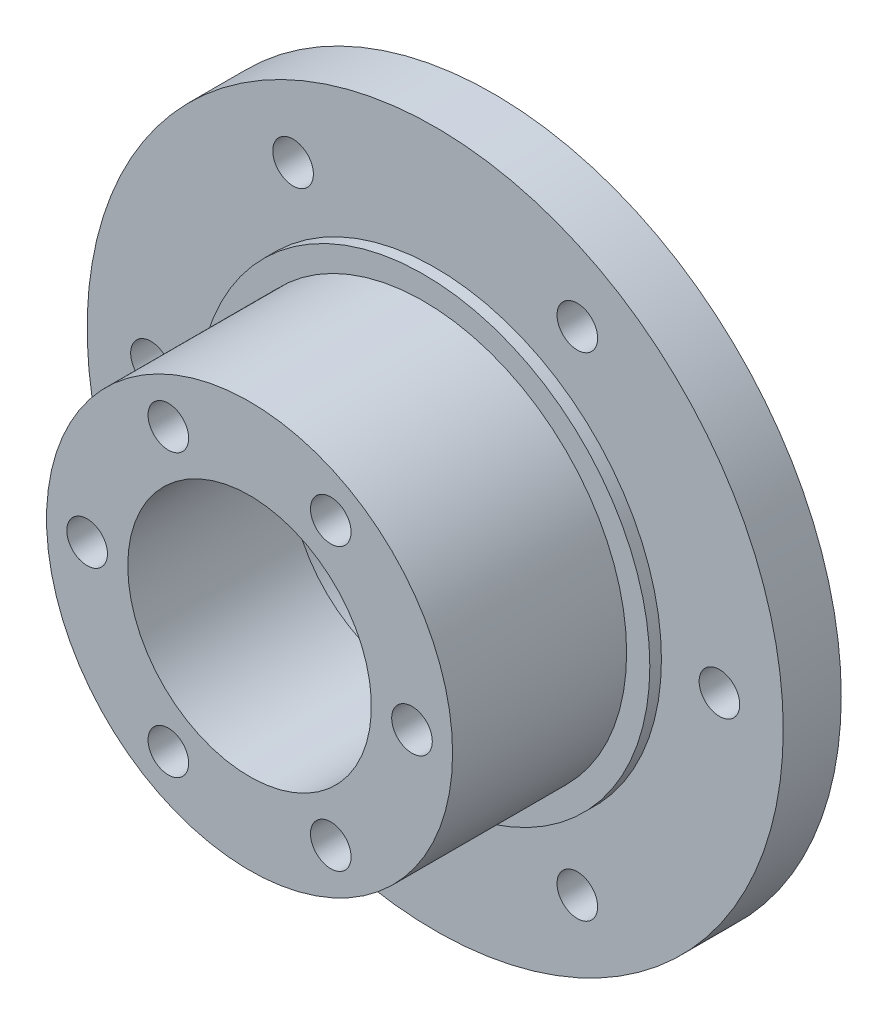
ISO-10303-21;
HEADER;
FILE_DESCRIPTION(('STEP AP214'),'2;1');
FILE_NAME('part.step','',(''),(''),'','','');
FILE_SCHEMA(('AUTOMOTIVE_DESIGN { 1 0 10303 214 1 1 1 1 }'));
ENDSEC;
DATA;
#1=APPLICATION_CONTEXT('core data for automotive mechanical design processes');
#2=APPLICATION_PROTOCOL_DEFINITION('international standard','automotive_design',2000,#1);
#3=PRODUCT_CONTEXT('',#1,'mechanical');
#4=PRODUCT('Part','Part','',(#3));
#5=PRODUCT_RELATED_PRODUCT_CATEGORY('part','',(#4));
#6=PRODUCT_DEFINITION_FORMATION('','',#4);
#7=PRODUCT_DEFINITION_CONTEXT('part definition',#1,'design');
#8=PRODUCT_DEFINITION('design','',#6,#7);
#9=PRODUCT_DEFINITION_SHAPE('','',#8);
#10=(LENGTH_UNIT() NAMED_UNIT(*) SI_UNIT(.MILLI.,.METRE.));
#11=(NAMED_UNIT(*) PLANE_ANGLE_UNIT() SI_UNIT($,.RADIAN.));
#12=(NAMED_UNIT(*) SI_UNIT($,.STERADIAN.) SOLID_ANGLE_UNIT());
#13=UNCERTAINTY_MEASURE_WITH_UNIT(LENGTH_MEASURE(1.E-05),#10,'distance_accuracy_value','');
#14=(GEOMETRIC_REPRESENTATION_CONTEXT(3) GLOBAL_UNCERTAINTY_ASSIGNED_CONTEXT((#13)) GLOBAL_UNIT_ASSIGNED_CONTEXT((#10,
#11,#12)) REPRESENTATION_CONTEXT('',''));
#15=CARTESIAN_POINT('',(0.,0.,0.));
#16=DIRECTION('',(0.,0.,1.));
#17=DIRECTION('',(1.,0.,0.));
#18=AXIS2_PLACEMENT_3D('',#15,#16,#17);
#19=CARTESIAN_POINT('',(0.,0.,5.));
#20=DIRECTION('',(0.,0.,-1.));
#21=DIRECTION('',(-1.,0.,0.));
#22=AXIS2_PLACEMENT_3D('',#19,#20,#21);
#23=CYLINDRICAL_SURFACE('',#22,30.);
#24=CARTESIAN_POINT('',(0.,0.,5.));
#25=DIRECTION('',(0.,0.,1.));
#26=DIRECTION('',(1.,0.,0.));
#27=AXIS2_PLACEMENT_3D('',#24,#25,#26);
#28=CIRCLE('',#27,30.);
#29=CARTESIAN_POINT('',(30.,0.,5.));
#30=VERTEX_POINT('',#29);
#31=EDGE_CURVE('E47',#30,#30,#28,.T.);
#32=ORIENTED_EDGE('',*,*,#31,.F.);
#33=EDGE_LOOP('',(#32));
#34=FACE_BOUND('',#33,.T.);
#35=CARTESIAN_POINT('',(0.,0.,0.));
#36=DIRECTION('',(0.,0.,1.));
#37=DIRECTION('',(1.,0.,0.));
#38=AXIS2_PLACEMENT_3D('',#35,#36,#37);
#39=CIRCLE('',#38,30.);
#40=CARTESIAN_POINT('',(30.,0.,0.));
#41=VERTEX_POINT('',#40);
#42=EDGE_CURVE('E38',#41,#41,#39,.T.);
#43=ORIENTED_EDGE('',*,*,#42,.T.);
#44=EDGE_LOOP('',(#43));
#45=FACE_BOUND('',#44,.T.);
#46=ADVANCED_FACE('F35',(#34,#45),#23,.T.);
#47=CARTESIAN_POINT('',(0.,0.,5.));
#48=DIRECTION('',(0.,0.,1.));
#49=DIRECTION('',(1.,0.,0.));
#50=AXIS2_PLACEMENT_3D('',#47,#48,#49);
#51=PLANE('',#50);
#52=CARTESIAN_POINT('',(24.5,0.,5.));
#53=DIRECTION('',(0.,0.,1.));
#54=DIRECTION('',(1.,0.,0.));
#55=AXIS2_PLACEMENT_3D('',#52,#53,#54);
#56=CIRCLE('',#55,1.75);
#57=CARTESIAN_POINT('',(26.25,0.,5.));
#58=VERTEX_POINT('',#57);
#59=EDGE_CURVE('E388',#58,#58,#56,.T.);
#60=ORIENTED_EDGE('',*,*,#59,.F.);
#61=EDGE_LOOP('',(#60));
#62=FACE_BOUND('',#61,.T.);
#63=CARTESIAN_POINT('',(12.2500000000002,21.2176223927186,5.));
#64=DIRECTION('',(0.,0.,1.));
#65=DIRECTION('',(1.,0.,0.));
#66=AXIS2_PLACEMENT_3D('',#63,#64,#65);
#67=CIRCLE('',#66,1.75);
#68=CARTESIAN_POINT('',(14.0000000000002,21.2176223927186,5.));
#69=VERTEX_POINT('',#68);
#70=EDGE_CURVE('E389',#69,#69,#67,.T.);
#71=ORIENTED_EDGE('',*,*,#70,.F.);
#72=EDGE_LOOP('',(#71));
#73=FACE_BOUND('',#72,.T.);
#74=CARTESIAN_POINT('',(-12.2499999999998,21.2176223927189,5.));
#75=DIRECTION('',(0.,0.,1.));
#76=DIRECTION('',(1.,0.,0.));
#77=AXIS2_PLACEMENT_3D('',#74,#75,#76);
#78=CIRCLE('',#77,1.75);
#79=CARTESIAN_POINT('',(-10.4999999999998,21.2176223927189,5.));
#80=VERTEX_POINT('',#79);
#81=EDGE_CURVE('E363',#80,#80,#78,.T.);
#82=ORIENTED_EDGE('',*,*,#81,.F.);
#83=EDGE_LOOP('',(#82));
#84=FACE_BOUND('',#83,.T.);
#85=CARTESIAN_POINT('',(-24.5,1.71082585603314E-13,5.));
#86=DIRECTION('',(0.,0.,1.));
#87=DIRECTION('',(1.,0.,0.));
#88=AXIS2_PLACEMENT_3D('',#85,#86,#87);
#89=CIRCLE('',#88,1.75);
#90=CARTESIAN_POINT('',(-22.75,1.71082585603314E-13,5.));
#91=VERTEX_POINT('',#90);
#92=EDGE_CURVE('E370',#91,#91,#89,.T.);
#93=ORIENTED_EDGE('',*,*,#92,.F.);
#94=EDGE_LOOP('',(#93));
#95=FACE_BOUND('',#94,.T.);
#96=CARTESIAN_POINT('',(-12.2500000000001,-21.2176223927187,5.));
#97=DIRECTION('',(0.,0.,1.));
#98=DIRECTION('',(1.,0.,0.));
#99=AXIS2_PLACEMENT_3D('',#96,#97,#98);
#100=CIRCLE('',#99,1.75);
#101=CARTESIAN_POINT('',(-10.5000000000001,-21.2176223927187,5.));
#102=VERTEX_POINT('',#101);
#103=EDGE_CURVE('E376',#102,#102,#100,.T.);
#104=ORIENTED_EDGE('',*,*,#103,.F.);
#105=EDGE_LOOP('',(#104));
#106=FACE_BOUND('',#105,.T.);
#107=CARTESIAN_POINT('',(12.25,-21.2176223927188,5.));
#108=DIRECTION('',(0.,0.,1.));
#109=DIRECTION('',(1.,0.,0.));
#110=AXIS2_PLACEMENT_3D('',#107,#108,#109);
#111=CIRCLE('',#110,1.75);
#112=CARTESIAN_POINT('',(14.,-21.2176223927188,5.));
#113=VERTEX_POINT('',#112);
#114=EDGE_CURVE('E382',#113,#113,#111,.T.);
#115=ORIENTED_EDGE('',*,*,#114,.F.);
#116=EDGE_LOOP('',(#115));
#117=FACE_BOUND('',#116,.T.);
#118=CARTESIAN_POINT('',(0.,0.,5.));
#119=DIRECTION('',(0.,0.,1.));
#120=DIRECTION('',(1.,0.,0.));
#121=AXIS2_PLACEMENT_3D('',#118,#119,#120);
#122=CIRCLE('',#121,19.5);
#123=CARTESIAN_POINT('',(19.5,0.,5.));
#124=VERTEX_POINT('',#123);
#125=EDGE_CURVE('E42',#124,#124,#122,.T.);
#126=ORIENTED_EDGE('',*,*,#125,.F.);
#127=EDGE_LOOP('',(#126));
#128=FACE_BOUND('',#127,.T.);
#129=ORIENTED_EDGE('',*,*,#31,.T.);
#130=EDGE_LOOP('',(#129));
#131=FACE_BOUND('',#130,.T.);
#132=ADVANCED_FACE('F65',(#62,#73,#84,#95,#106,#117,#128,#131),#51,.T.);
#133=CARTESIAN_POINT('',(0.,0.,0.));
#134=DIRECTION('',(0.,0.,1.));
#135=DIRECTION('',(1.,0.,0.));
#136=AXIS2_PLACEMENT_3D('',#133,#134,#135);
#137=PLANE('',#136);
#138=CARTESIAN_POINT('',(24.5,0.,0.));
#139=DIRECTION('',(0.,0.,1.));
#140=DIRECTION('',(1.,0.,0.));
#141=AXIS2_PLACEMENT_3D('',#138,#139,#140);
#142=CIRCLE('',#141,1.75);
#143=CARTESIAN_POINT('',(26.25,0.,0.));
#144=VERTEX_POINT('',#143);
#145=EDGE_CURVE('E360',#144,#144,#142,.T.);
#146=ORIENTED_EDGE('',*,*,#145,.T.);
#147=EDGE_LOOP('',(#146));
#148=FACE_BOUND('',#147,.T.);
#149=CARTESIAN_POINT('',(12.2500000000002,21.2176223927186,0.));
#150=DIRECTION('',(0.,0.,1.));
#151=DIRECTION('',(1.,0.,0.));
#152=AXIS2_PLACEMENT_3D('',#149,#150,#151);
#153=CIRCLE('',#152,1.75);
#154=CARTESIAN_POINT('',(14.0000000000002,21.2176223927186,0.));
#155=VERTEX_POINT('',#154);
#156=EDGE_CURVE('E367',#155,#155,#153,.T.);
#157=ORIENTED_EDGE('',*,*,#156,.T.);
#158=EDGE_LOOP('',(#157));
#159=FACE_BOUND('',#158,.T.);
#160=CARTESIAN_POINT('',(-12.2499999999998,21.2176223927189,0.));
#161=DIRECTION('',(0.,0.,1.));
#162=DIRECTION('',(1.,0.,0.));
#163=AXIS2_PLACEMENT_3D('',#160,#161,#162);
#164=CIRCLE('',#163,1.75);
#165=CARTESIAN_POINT('',(-10.4999999999998,21.2176223927189,0.));
#166=VERTEX_POINT('',#165);
#167=EDGE_CURVE('E366',#166,#166,#164,.T.);
#168=ORIENTED_EDGE('',*,*,#167,.T.);
#169=EDGE_LOOP('',(#168));
#170=FACE_BOUND('',#169,.T.);
#171=CARTESIAN_POINT('',(-24.5,1.71082585603314E-13,0.));
#172=DIRECTION('',(0.,0.,1.));
#173=DIRECTION('',(1.,0.,0.));
#174=AXIS2_PLACEMENT_3D('',#171,#172,#173);
#175=CIRCLE('',#174,1.75);
#176=CARTESIAN_POINT('',(-22.75,1.71082585603314E-13,0.));
#177=VERTEX_POINT('',#176);
#178=EDGE_CURVE('E373',#177,#177,#175,.T.);
#179=ORIENTED_EDGE('',*,*,#178,.T.);
#180=EDGE_LOOP('',(#179));
#181=FACE_BOUND('',#180,.T.);
#182=CARTESIAN_POINT('',(-12.2500000000001,-21.2176223927187,0.));
#183=DIRECTION('',(0.,0.,1.));
#184=DIRECTION('',(1.,0.,0.));
#185=AXIS2_PLACEMENT_3D('',#182,#183,#184);
#186=CIRCLE('',#185,1.75);
#187=CARTESIAN_POINT('',(-10.5000000000001,-21.2176223927187,0.));
#188=VERTEX_POINT('',#187);
#189=EDGE_CURVE('E379',#188,#188,#186,.T.);
#190=ORIENTED_EDGE('',*,*,#189,.T.);
#191=EDGE_LOOP('',(#190));
#192=FACE_BOUND('',#191,.T.);
#193=CARTESIAN_POINT('',(12.25,-21.2176223927188,0.));
#194=DIRECTION('',(0.,0.,1.));
#195=DIRECTION('',(1.,0.,0.));
#196=AXIS2_PLACEMENT_3D('',#193,#194,#195);
#197=CIRCLE('',#196,1.75);
#198=CARTESIAN_POINT('',(14.,-21.2176223927188,0.));
#199=VERTEX_POINT('',#198);
#200=EDGE_CURVE('E385',#199,#199,#197,.T.);
#201=ORIENTED_EDGE('',*,*,#200,.T.);
#202=EDGE_LOOP('',(#201));
#203=FACE_BOUND('',#202,.T.);
#204=CARTESIAN_POINT('',(0.,0.,0.));
#205=DIRECTION('',(0.,0.,-1.));
#206=DIRECTION('',(-1.,0.,0.));
#207=AXIS2_PLACEMENT_3D('',#204,#205,#206);
#208=CIRCLE('',#207,12.025);
#209=CARTESIAN_POINT('',(-12.025,0.,0.));
#210=VERTEX_POINT('',#209);
#211=EDGE_CURVE('E350',#210,#210,#208,.T.);
#212=ORIENTED_EDGE('',*,*,#211,.F.);
#213=EDGE_LOOP('',(#212));
#214=FACE_BOUND('',#213,.T.);
#215=ORIENTED_EDGE('',*,*,#42,.F.);
#216=EDGE_LOOP('',(#215));
#217=FACE_BOUND('',#216,.T.);
#218=ADVANCED_FACE('F62',(#148,#159,#170,#181,#192,#203,#214,#217),#137,.F.);
#219=CARTESIAN_POINT('',(0.,0.,6.));
#220=DIRECTION('',(0.,0.,-1.));
#221=DIRECTION('',(-1.,0.,0.));
#222=AXIS2_PLACEMENT_3D('',#219,#220,#221);
#223=CYLINDRICAL_SURFACE('',#222,19.5);
#224=CARTESIAN_POINT('',(0.,0.,6.));
#225=DIRECTION('',(0.,0.,1.));
#226=DIRECTION('',(1.,0.,0.));
#227=AXIS2_PLACEMENT_3D('',#224,#225,#226);
#228=CIRCLE('',#227,19.5);
#229=CARTESIAN_POINT('',(19.5,0.,6.));
#230=VERTEX_POINT('',#229);
#231=EDGE_CURVE('E53',#230,#230,#228,.T.);
#232=ORIENTED_EDGE('',*,*,#231,.F.);
#233=EDGE_LOOP('',(#232));
#234=FACE_BOUND('',#233,.T.);
#235=ORIENTED_EDGE('',*,*,#125,.T.);
#236=EDGE_LOOP('',(#235));
#237=FACE_BOUND('',#236,.T.);
#238=ADVANCED_FACE('F64',(#234,#237),#223,.T.);
#239=CARTESIAN_POINT('',(0.,0.,6.));
#240=DIRECTION('',(0.,0.,1.));
#241=DIRECTION('',(1.,0.,0.));
#242=AXIS2_PLACEMENT_3D('',#239,#240,#241);
#243=PLANE('',#242);
#244=CARTESIAN_POINT('',(0.,0.,6.));
#245=DIRECTION('',(0.,0.,1.));
#246=DIRECTION('',(1.,0.,0.));
#247=AXIS2_PLACEMENT_3D('',#244,#245,#246);
#248=CIRCLE('',#247,17.5);
#249=CARTESIAN_POINT('',(17.5,0.,6.));
#250=VERTEX_POINT('',#249);
#251=EDGE_CURVE('E10',#250,#250,#248,.T.);
#252=ORIENTED_EDGE('',*,*,#251,.F.);
#253=EDGE_LOOP('',(#252));
#254=FACE_BOUND('',#253,.T.);
#255=ORIENTED_EDGE('',*,*,#231,.T.);
#256=EDGE_LOOP('',(#255));
#257=FACE_BOUND('',#256,.T.);
#258=ADVANCED_FACE('F71',(#254,#257),#243,.T.);
#259=CARTESIAN_POINT('',(0.,0.,21.));
#260=DIRECTION('',(0.,0.,-1.));
#261=DIRECTION('',(-1.,0.,0.));
#262=AXIS2_PLACEMENT_3D('',#259,#260,#261);
#263=CYLINDRICAL_SURFACE('',#262,17.5);
#264=CARTESIAN_POINT('',(0.,0.,21.));
#265=DIRECTION('',(0.,0.,1.));
#266=DIRECTION('',(1.,0.,0.));
#267=AXIS2_PLACEMENT_3D('',#264,#265,#266);
#268=CIRCLE('',#267,17.5);
#269=CARTESIAN_POINT('',(17.5,0.,21.));
#270=VERTEX_POINT('',#269);
#271=EDGE_CURVE('E51',#270,#270,#268,.T.);
#272=ORIENTED_EDGE('',*,*,#271,.F.);
#273=EDGE_LOOP('',(#272));
#274=FACE_BOUND('',#273,.T.);
#275=ORIENTED_EDGE('',*,*,#251,.T.);
#276=EDGE_LOOP('',(#275));
#277=FACE_BOUND('',#276,.T.);
#278=ADVANCED_FACE('F172',(#274,#277),#263,.T.);
#279=CARTESIAN_POINT('',(0.,0.,21.));
#280=DIRECTION('',(0.,0.,1.));
#281=DIRECTION('',(1.,0.,0.));
#282=AXIS2_PLACEMENT_3D('',#279,#280,#281);
#283=PLANE('',#282);
#284=CARTESIAN_POINT('',(14.,0.,21.));
#285=DIRECTION('',(0.,0.,1.));
#286=DIRECTION('',(1.,0.,0.));
#287=AXIS2_PLACEMENT_3D('',#284,#285,#286);
#288=CIRCLE('',#287,1.75);
#289=CARTESIAN_POINT('',(15.75,0.,21.));
#290=VERTEX_POINT('',#289);
#291=EDGE_CURVE('E423',#290,#290,#288,.T.);
#292=ORIENTED_EDGE('',*,*,#291,.F.);
#293=EDGE_LOOP('',(#292));
#294=FACE_BOUND('',#293,.T.);
#295=CARTESIAN_POINT('',(7.00000000000014,12.1243556529821,21.));
#296=DIRECTION('',(0.,0.,1.));
#297=DIRECTION('',(1.,0.,0.));
#298=AXIS2_PLACEMENT_3D('',#295,#296,#297);
#299=CIRCLE('',#298,1.75);
#300=CARTESIAN_POINT('',(8.75000000000014,12.1243556529821,21.));
#301=VERTEX_POINT('',#300);
#302=EDGE_CURVE('E424',#301,#301,#299,.T.);
#303=ORIENTED_EDGE('',*,*,#302,.F.);
#304=EDGE_LOOP('',(#303));
#305=FACE_BOUND('',#304,.T.);
#306=CARTESIAN_POINT('',(-6.99999999999989,12.1243556529822,21.));
#307=DIRECTION('',(0.,0.,1.));
#308=DIRECTION('',(1.,0.,0.));
#309=AXIS2_PLACEMENT_3D('',#306,#307,#308);
#310=CIRCLE('',#309,1.75);
#311=CARTESIAN_POINT('',(-5.24999999999989,12.1243556529822,21.));
#312=VERTEX_POINT('',#311);
#313=EDGE_CURVE('E398',#312,#312,#310,.T.);
#314=ORIENTED_EDGE('',*,*,#313,.F.);
#315=EDGE_LOOP('',(#314));
#316=FACE_BOUND('',#315,.T.);
#317=CARTESIAN_POINT('',(-14.,0.,21.));
#318=DIRECTION('',(0.,0.,1.));
#319=DIRECTION('',(1.,0.,0.));
#320=AXIS2_PLACEMENT_3D('',#317,#318,#319);
#321=CIRCLE('',#320,1.75);
#322=CARTESIAN_POINT('',(-12.25,0.,21.));
#323=VERTEX_POINT('',#322);
#324=EDGE_CURVE('E405',#323,#323,#321,.T.);
#325=ORIENTED_EDGE('',*,*,#324,.F.);
#326=EDGE_LOOP('',(#325));
#327=FACE_BOUND('',#326,.T.);
#328=CARTESIAN_POINT('',(-7.00000000000006,-12.1243556529821,21.));
#329=DIRECTION('',(0.,0.,1.));
#330=DIRECTION('',(1.,0.,0.));
#331=AXIS2_PLACEMENT_3D('',#328,#329,#330);
#332=CIRCLE('',#331,1.75);
#333=CARTESIAN_POINT('',(-5.25000000000006,-12.1243556529821,21.));
#334=VERTEX_POINT('',#333);
#335=EDGE_CURVE('E411',#334,#334,#332,.T.);
#336=ORIENTED_EDGE('',*,*,#335,.F.);
#337=EDGE_LOOP('',(#336));
#338=FACE_BOUND('',#337,.T.);
#339=CARTESIAN_POINT('',(6.99999999999997,-12.1243556529822,21.));
#340=DIRECTION('',(0.,0.,1.));
#341=DIRECTION('',(1.,0.,0.));
#342=AXIS2_PLACEMENT_3D('',#339,#340,#341);
#343=CIRCLE('',#342,1.75);
#344=CARTESIAN_POINT('',(8.74999999999997,-12.1243556529822,21.));
#345=VERTEX_POINT('',#344);
#346=EDGE_CURVE('E417',#345,#345,#343,.T.);
#347=ORIENTED_EDGE('',*,*,#346,.F.);
#348=EDGE_LOOP('',(#347));
#349=FACE_BOUND('',#348,.T.);
#350=CARTESIAN_POINT('',(0.,0.,21.));
#351=DIRECTION('',(0.,0.,-1.));
#352=DIRECTION('',(-1.,0.,0.));
#353=AXIS2_PLACEMENT_3D('',#350,#351,#352);
#354=CIRCLE('',#353,10.5);
#355=CARTESIAN_POINT('',(-10.5,0.,21.));
#356=VERTEX_POINT('',#355);
#357=EDGE_CURVE('E355',#356,#356,#354,.T.);
#358=ORIENTED_EDGE('',*,*,#357,.T.);
#359=EDGE_LOOP('',(#358));
#360=FACE_BOUND('',#359,.T.);
#361=ORIENTED_EDGE('',*,*,#271,.T.);
#362=EDGE_LOOP('',(#361));
#363=FACE_BOUND('',#362,.T.);
#364=ADVANCED_FACE('F166',(#294,#305,#316,#327,#338,#349,#360,#363),#283,.T.);
#365=CARTESIAN_POINT('',(0.,0.,7.));
#366=DIRECTION('',(0.,0.,-1.));
#367=DIRECTION('',(-1.,0.,0.));
#368=AXIS2_PLACEMENT_3D('',#365,#366,#367);
#369=CYLINDRICAL_SURFACE('',#368,12.025);
#370=CARTESIAN_POINT('',(0.,0.,7.));
#371=DIRECTION('',(0.,0.,-1.));
#372=DIRECTION('',(-1.,0.,0.));
#373=AXIS2_PLACEMENT_3D('',#370,#371,#372);
#374=CIRCLE('',#373,12.025);
#375=CARTESIAN_POINT('',(-12.025,0.,7.));
#376=VERTEX_POINT('',#375);
#377=EDGE_CURVE('E348',#376,#376,#374,.T.);
#378=ORIENTED_EDGE('',*,*,#377,.F.);
#379=EDGE_LOOP('',(#378));
#380=FACE_BOUND('',#379,.T.);
#381=ORIENTED_EDGE('',*,*,#211,.T.);
#382=EDGE_LOOP('',(#381));
#383=FACE_BOUND('',#382,.T.);
#384=ADVANCED_FACE('F171',(#380,#383),#369,.F.);
#385=CARTESIAN_POINT('',(0.,0.,7.));
#386=DIRECTION('',(0.,0.,-1.));
#387=DIRECTION('',(-1.,0.,0.));
#388=AXIS2_PLACEMENT_3D('',#385,#386,#387);
#389=PLANE('',#388);
#390=CARTESIAN_POINT('',(0.,0.,7.));
#391=DIRECTION('',(0.,0.,-1.));
#392=DIRECTION('',(-1.,0.,0.));
#393=AXIS2_PLACEMENT_3D('',#390,#391,#392);
#394=CIRCLE('',#393,10.5);
#395=CARTESIAN_POINT('',(-10.5,0.,7.));
#396=VERTEX_POINT('',#395);
#397=EDGE_CURVE('E357',#396,#396,#394,.T.);
#398=ORIENTED_EDGE('',*,*,#397,.F.);
#399=EDGE_LOOP('',(#398));
#400=FACE_BOUND('',#399,.T.);
#401=ORIENTED_EDGE('',*,*,#377,.T.);
#402=EDGE_LOOP('',(#401));
#403=FACE_BOUND('',#402,.T.);
#404=ADVANCED_FACE('F301',(#400,#403),#389,.T.);
#405=CARTESIAN_POINT('',(0.,0.,21.));
#406=DIRECTION('',(0.,0.,-1.));
#407=DIRECTION('',(-1.,0.,0.));
#408=AXIS2_PLACEMENT_3D('',#405,#406,#407);
#409=CYLINDRICAL_SURFACE('',#408,10.5);
#410=CARTESIAN_POINT('',(-10.5,0.,21.));
#411=CARTESIAN_POINT('',(-10.5,0.,20.8541666666667));
#412=CARTESIAN_POINT('',(-10.5,0.,20.7083333333333));
#413=CARTESIAN_POINT('',(-10.5,0.,20.4166666666667));
#414=CARTESIAN_POINT('',(-10.5,0.,20.2708333333333));
#415=CARTESIAN_POINT('',(-10.5,0.,19.9791666666667));
#416=CARTESIAN_POINT('',(-10.5,0.,19.8333333333333));
#417=CARTESIAN_POINT('',(-10.5,0.,19.5416666666667));
#418=CARTESIAN_POINT('',(-10.5,0.,19.3958333333333));
#419=CARTESIAN_POINT('',(-10.5,0.,19.1041666666667));
#420=CARTESIAN_POINT('',(-10.5,0.,18.9583333333333));
#421=CARTESIAN_POINT('',(-10.5,0.,18.6666666666667));
#422=CARTESIAN_POINT('',(-10.5,0.,18.5208333333333));
#423=CARTESIAN_POINT('',(-10.5,0.,18.2291666666667));
#424=CARTESIAN_POINT('',(-10.5,0.,18.0833333333333));
#425=CARTESIAN_POINT('',(-10.5,0.,17.7916666666667));
#426=CARTESIAN_POINT('',(-10.5,0.,17.6458333333333));
#427=CARTESIAN_POINT('',(-10.5,0.,17.3541666666667));
#428=CARTESIAN_POINT('',(-10.5,0.,17.2083333333333));
#429=CARTESIAN_POINT('',(-10.5,0.,16.9166666666667));
#430=CARTESIAN_POINT('',(-10.5,0.,16.7708333333333));
#431=CARTESIAN_POINT('',(-10.5,0.,16.4791666666667));
#432=CARTESIAN_POINT('',(-10.5,0.,16.3333333333333));
#433=CARTESIAN_POINT('',(-10.5,0.,16.0416666666667));
#434=CARTESIAN_POINT('',(-10.5,0.,15.8958333333333));
#435=CARTESIAN_POINT('',(-10.5,0.,15.6041666666667));
#436=CARTESIAN_POINT('',(-10.5,0.,15.4583333333333));
#437=CARTESIAN_POINT('',(-10.5,0.,15.1666666666667));
#438=CARTESIAN_POINT('',(-10.5,0.,15.0208333333333));
#439=CARTESIAN_POINT('',(-10.5,0.,14.7291666666667));
#440=CARTESIAN_POINT('',(-10.5,0.,14.5833333333333));
#441=CARTESIAN_POINT('',(-10.5,0.,14.2916666666667));
#442=CARTESIAN_POINT('',(-10.5,0.,14.1458333333333));
#443=CARTESIAN_POINT('',(-10.5,0.,13.8541666666667));
#444=CARTESIAN_POINT('',(-10.5,0.,13.7083333333333));
#445=CARTESIAN_POINT('',(-10.5,0.,13.4166666666667));
#446=CARTESIAN_POINT('',(-10.5,0.,13.2708333333333));
#447=CARTESIAN_POINT('',(-10.5,0.,12.9791666666667));
#448=CARTESIAN_POINT('',(-10.5,0.,12.8333333333333));
#449=CARTESIAN_POINT('',(-10.5,0.,12.5416666666667));
#450=CARTESIAN_POINT('',(-10.5,0.,12.3958333333333));
#451=CARTESIAN_POINT('',(-10.5,0.,12.1041666666667));
#452=CARTESIAN_POINT('',(-10.5,0.,11.9583333333333));
#453=CARTESIAN_POINT('',(-10.5,0.,11.6666666666667));
#454=CARTESIAN_POINT('',(-10.5,0.,11.5208333333333));
#455=CARTESIAN_POINT('',(-10.5,0.,11.2291666666667));
#456=CARTESIAN_POINT('',(-10.5,0.,11.0833333333333));
#457=CARTESIAN_POINT('',(-10.5,0.,10.7916666666667));
#458=CARTESIAN_POINT('',(-10.5,0.,10.6458333333333));
#459=CARTESIAN_POINT('',(-10.5,0.,10.3541666666667));
#460=CARTESIAN_POINT('',(-10.5,0.,10.2083333333333));
#461=CARTESIAN_POINT('',(-10.5,0.,9.91666666666667));
#462=CARTESIAN_POINT('',(-10.5,0.,9.77083333333333));
#463=CARTESIAN_POINT('',(-10.5,0.,9.47916666666667));
#464=CARTESIAN_POINT('',(-10.5,0.,9.33333333333333));
#465=CARTESIAN_POINT('',(-10.5,0.,9.04166666666667));
#466=CARTESIAN_POINT('',(-10.5,0.,8.89583333333333));
#467=CARTESIAN_POINT('',(-10.5,0.,8.60416666666667));
#468=CARTESIAN_POINT('',(-10.5,0.,8.45833333333333));
#469=CARTESIAN_POINT('',(-10.5,0.,8.16666666666667));
#470=CARTESIAN_POINT('',(-10.5,0.,8.02083333333333));
#471=CARTESIAN_POINT('',(-10.5,0.,7.72916666666667));
#472=CARTESIAN_POINT('',(-10.5,0.,7.58333333333333));
#473=CARTESIAN_POINT('',(-10.5,0.,7.29166666666667));
#474=CARTESIAN_POINT('',(-10.5,0.,7.14583333333333));
#475=CARTESIAN_POINT('',(-10.5,0.,7.));
#476=B_SPLINE_CURVE_WITH_KNOTS('',3,(#410,#411,#412,#413,#414,#415,#416,#417,#418,#419,#420,
#421,#422,#423,#424,#425,#426,#427,#428,#429,#430,#431,#432,#433,#434,#435,#436,#437,#438,#439,
#440,#441,#442,#443,#444,#445,#446,#447,#448,#449,#450,#451,#452,#453,#454,#455,#456,#457,#458,
#459,#460,#461,#462,#463,#464,#465,#466,#467,#468,#469,#470,#471,#472,#473,#474,#475),
.UNSPECIFIED.,.F.,.F.,(4,2,2,2,2,2,2,2,2,2,2,2,2,2,2,2,2,2,2,2,2,2,2,2,2,2,2,2,2,2,2,2,4),(0.,
0.4375,0.875000000000001,1.3125,1.75,2.1875,2.625,3.0625,3.5,3.9375,4.375,4.8125,5.25,5.6875,
6.125,6.5625,7.,7.4375,7.875,8.3125,8.75,9.1875,9.625,10.0625,10.5,10.9375,11.375,11.8125,12.25,
12.6875,13.125,13.5625,14.),.UNSPECIFIED.);
#477=EDGE_CURVE('BSEAM93',#356,#396,#476,.T.);
#478=ORIENTED_EDGE('',*,*,#357,.F.);
#479=ORIENTED_EDGE('',*,*,#397,.T.);
#480=ORIENTED_EDGE('',*,*,#477,.T.);
#481=ORIENTED_EDGE('',*,*,#477,.F.);
#482=EDGE_LOOP('',(#478,#480,#479,#481));
#483=FACE_BOUND('',#482,.T.);
#484=ADVANCED_FACE('F93',(#483),#409,.F.);
#485=CARTESIAN_POINT('',(12.25,-21.2176223927188,0.));
#486=DIRECTION('',(0.,0.,1.));
#487=DIRECTION('',(1.,0.,0.));
#488=AXIS2_PLACEMENT_3D('',#485,#486,#487);
#489=CYLINDRICAL_SURFACE('',#488,1.75);
#490=ORIENTED_EDGE('',*,*,#200,.F.);
#491=EDGE_LOOP('',(#490));
#492=FACE_BOUND('',#491,.T.);
#493=ORIENTED_EDGE('',*,*,#114,.T.);
#494=EDGE_LOOP('',(#493));
#495=FACE_BOUND('',#494,.T.);
#496=ADVANCED_FACE('F103',(#492,#495),#489,.F.);
#497=CARTESIAN_POINT('',(-12.2500000000001,-21.2176223927187,0.));
#498=DIRECTION('',(0.,0.,1.));
#499=DIRECTION('',(1.,0.,0.));
#500=AXIS2_PLACEMENT_3D('',#497,#498,#499);
#501=CYLINDRICAL_SURFACE('',#500,1.75);
#502=ORIENTED_EDGE('',*,*,#189,.F.);
#503=EDGE_LOOP('',(#502));
#504=FACE_BOUND('',#503,.T.);
#505=ORIENTED_EDGE('',*,*,#103,.T.);
#506=EDGE_LOOP('',(#505));
#507=FACE_BOUND('',#506,.T.);
#508=ADVANCED_FACE('F108',(#504,#507),#501,.F.);
#509=CARTESIAN_POINT('',(-24.5,1.71082585603314E-13,0.));
#510=DIRECTION('',(0.,0.,1.));
#511=DIRECTION('',(1.,0.,0.));
#512=AXIS2_PLACEMENT_3D('',#509,#510,#511);
#513=CYLINDRICAL_SURFACE('',#512,1.75);
#514=ORIENTED_EDGE('',*,*,#178,.F.);
#515=EDGE_LOOP('',(#514));
#516=FACE_BOUND('',#515,.T.);
#517=ORIENTED_EDGE('',*,*,#92,.T.);
#518=EDGE_LOOP('',(#517));
#519=FACE_BOUND('',#518,.T.);
#520=ADVANCED_FACE('F118',(#516,#519),#513,.F.);
#521=CARTESIAN_POINT('',(-12.2499999999998,21.2176223927189,0.));
#522=DIRECTION('',(0.,0.,1.));
#523=DIRECTION('',(1.,0.,0.));
#524=AXIS2_PLACEMENT_3D('',#521,#522,#523);
#525=CYLINDRICAL_SURFACE('',#524,1.75);
#526=ORIENTED_EDGE('',*,*,#167,.F.);
#527=EDGE_LOOP('',(#526));
#528=FACE_BOUND('',#527,.T.);
#529=ORIENTED_EDGE('',*,*,#81,.T.);
#530=EDGE_LOOP('',(#529));
#531=FACE_BOUND('',#530,.T.);
#532=ADVANCED_FACE('F128',(#528,#531),#525,.F.);
#533=CARTESIAN_POINT('',(12.2500000000002,21.2176223927186,0.));
#534=DIRECTION('',(0.,0.,1.));
#535=DIRECTION('',(1.,0.,0.));
#536=AXIS2_PLACEMENT_3D('',#533,#534,#535);
#537=CYLINDRICAL_SURFACE('',#536,1.75);
#538=ORIENTED_EDGE('',*,*,#156,.F.);
#539=EDGE_LOOP('',(#538));
#540=FACE_BOUND('',#539,.T.);
#541=ORIENTED_EDGE('',*,*,#70,.T.);
#542=EDGE_LOOP('',(#541));
#543=FACE_BOUND('',#542,.T.);
#544=ADVANCED_FACE('F138',(#540,#543),#537,.F.);
#545=CARTESIAN_POINT('',(24.5,0.,0.));
#546=DIRECTION('',(0.,0.,1.));
#547=DIRECTION('',(1.,0.,0.));
#548=AXIS2_PLACEMENT_3D('',#545,#546,#547);
#549=CYLINDRICAL_SURFACE('',#548,1.75);
#550=ORIENTED_EDGE('',*,*,#145,.F.);
#551=EDGE_LOOP('',(#550));
#552=FACE_BOUND('',#551,.T.);
#553=ORIENTED_EDGE('',*,*,#59,.T.);
#554=EDGE_LOOP('',(#553));
#555=FACE_BOUND('',#554,.T.);
#556=ADVANCED_FACE('F148',(#552,#555),#549,.F.);
#557=CARTESIAN_POINT('',(6.99999999999997,-12.1243556529822,9.));
#558=DIRECTION('',(0.,0.,1.));
#559=DIRECTION('',(1.,0.,0.));
#560=AXIS2_PLACEMENT_3D('',#557,#558,#559);
#561=CYLINDRICAL_SURFACE('',#560,1.75);
#562=CARTESIAN_POINT('',(6.99999999999997,-12.1243556529822,9.));
#563=DIRECTION('',(0.,0.,1.));
#564=DIRECTION('',(1.,0.,0.));
#565=AXIS2_PLACEMENT_3D('',#562,#563,#564);
#566=CIRCLE('',#565,1.75);
#567=CARTESIAN_POINT('',(8.74999999999997,-12.1243556529822,9.));
#568=VERTEX_POINT('',#567);
#569=EDGE_CURVE('E420',#568,#568,#566,.T.);
#570=ORIENTED_EDGE('',*,*,#569,.F.);
#571=EDGE_LOOP('',(#570));
#572=FACE_BOUND('',#571,.T.);
#573=ORIENTED_EDGE('',*,*,#346,.T.);
#574=EDGE_LOOP('',(#573));
#575=FACE_BOUND('',#574,.T.);
#576=ADVANCED_FACE('F158',(#572,#575),#561,.F.);
#577=CARTESIAN_POINT('',(6.99999999999997,-12.1243556529822,9.));
#578=DIRECTION('',(0.,0.,1.));
#579=DIRECTION('',(1.,0.,0.));
#580=AXIS2_PLACEMENT_3D('',#577,#578,#579);
#581=PLANE('',#580);
#582=ORIENTED_EDGE('',*,*,#569,.T.);
#583=EDGE_LOOP('',(#582));
#584=FACE_BOUND('',#583,.T.);
#585=ADVANCED_FACE('F184',(#584),#581,.T.);
#586=CARTESIAN_POINT('',(-7.00000000000006,-12.1243556529821,9.));
#587=DIRECTION('',(0.,0.,1.));
#588=DIRECTION('',(1.,0.,0.));
#589=AXIS2_PLACEMENT_3D('',#586,#587,#588);
#590=CYLINDRICAL_SURFACE('',#589,1.75);
#591=CARTESIAN_POINT('',(-7.00000000000006,-12.1243556529821,9.));
#592=DIRECTION('',(0.,0.,1.));
#593=DIRECTION('',(1.,0.,0.));
#594=AXIS2_PLACEMENT_3D('',#591,#592,#593);
#595=CIRCLE('',#594,1.75);
#596=CARTESIAN_POINT('',(-5.25000000000006,-12.1243556529821,9.));
#597=VERTEX_POINT('',#596);
#598=EDGE_CURVE('E414',#597,#597,#595,.T.);
#599=ORIENTED_EDGE('',*,*,#598,.F.);
#600=EDGE_LOOP('',(#599));
#601=FACE_BOUND('',#600,.T.);
#602=ORIENTED_EDGE('',*,*,#335,.T.);
#603=EDGE_LOOP('',(#602));
#604=FACE_BOUND('',#603,.T.);
#605=ADVANCED_FACE('F194',(#601,#604),#590,.F.);
#606=CARTESIAN_POINT('',(-7.00000000000006,-12.1243556529821,9.));
#607=DIRECTION('',(0.,0.,1.));
#608=DIRECTION('',(1.,0.,0.));
#609=AXIS2_PLACEMENT_3D('',#606,#607,#608);
#610=PLANE('',#609);
#611=ORIENTED_EDGE('',*,*,#598,.T.);
#612=EDGE_LOOP('',(#611));
#613=FACE_BOUND('',#612,.T.);
#614=ADVANCED_FACE('F204',(#613),#610,.T.);
#615=CARTESIAN_POINT('',(-14.,0.,9.));
#616=DIRECTION('',(0.,0.,1.));
#617=DIRECTION('',(1.,0.,0.));
#618=AXIS2_PLACEMENT_3D('',#615,#616,#617);
#619=CYLINDRICAL_SURFACE('',#618,1.75);
#620=CARTESIAN_POINT('',(-14.,0.,9.));
#621=DIRECTION('',(0.,0.,1.));
#622=DIRECTION('',(1.,0.,0.));
#623=AXIS2_PLACEMENT_3D('',#620,#621,#622);
#624=CIRCLE('',#623,1.75);
#625=CARTESIAN_POINT('',(-12.25,0.,9.));
#626=VERTEX_POINT('',#625);
#627=EDGE_CURVE('E408',#626,#626,#624,.T.);
#628=ORIENTED_EDGE('',*,*,#627,.F.);
#629=EDGE_LOOP('',(#628));
#630=FACE_BOUND('',#629,.T.);
#631=ORIENTED_EDGE('',*,*,#324,.T.);
#632=EDGE_LOOP('',(#631));
#633=FACE_BOUND('',#632,.T.);
#634=ADVANCED_FACE('F214',(#630,#633),#619,.F.);
#635=CARTESIAN_POINT('',(-14.,0.,9.));
#636=DIRECTION('',(0.,0.,1.));
#637=DIRECTION('',(1.,0.,0.));
#638=AXIS2_PLACEMENT_3D('',#635,#636,#637);
#639=PLANE('',#638);
#640=ORIENTED_EDGE('',*,*,#627,.T.);
#641=EDGE_LOOP('',(#640));
#642=FACE_BOUND('',#641,.T.);
#643=ADVANCED_FACE('F224',(#642),#639,.T.);
#644=CARTESIAN_POINT('',(-6.99999999999989,12.1243556529822,9.));
#645=DIRECTION('',(0.,0.,1.));
#646=DIRECTION('',(1.,0.,0.));
#647=AXIS2_PLACEMENT_3D('',#644,#645,#646);
#648=CYLINDRICAL_SURFACE('',#647,1.75);
#649=CARTESIAN_POINT('',(-6.99999999999989,12.1243556529822,9.));
#650=DIRECTION('',(0.,0.,1.));
#651=DIRECTION('',(1.,0.,0.));
#652=AXIS2_PLACEMENT_3D('',#649,#650,#651);
#653=CIRCLE('',#652,1.75);
#654=CARTESIAN_POINT('',(-5.24999999999989,12.1243556529822,9.));
#655=VERTEX_POINT('',#654);
#656=EDGE_CURVE('E401',#655,#655,#653,.T.);
#657=ORIENTED_EDGE('',*,*,#656,.F.);
#658=EDGE_LOOP('',(#657));
#659=FACE_BOUND('',#658,.T.);
#660=ORIENTED_EDGE('',*,*,#313,.T.);
#661=EDGE_LOOP('',(#660));
#662=FACE_BOUND('',#661,.T.);
#663=ADVANCED_FACE('F234',(#659,#662),#648,.F.);
#664=CARTESIAN_POINT('',(-6.99999999999989,12.1243556529822,9.));
#665=DIRECTION('',(0.,0.,1.));
#666=DIRECTION('',(1.,0.,0.));
#667=AXIS2_PLACEMENT_3D('',#664,#665,#666);
#668=PLANE('',#667);
#669=ORIENTED_EDGE('',*,*,#656,.T.);
#670=EDGE_LOOP('',(#669));
#671=FACE_BOUND('',#670,.T.);
#672=ADVANCED_FACE('F244',(#671),#668,.T.);
#673=CARTESIAN_POINT('',(7.00000000000014,12.1243556529821,9.));
#674=DIRECTION('',(0.,0.,1.));
#675=DIRECTION('',(1.,0.,0.));
#676=AXIS2_PLACEMENT_3D('',#673,#674,#675);
#677=CYLINDRICAL_SURFACE('',#676,1.75);
#678=CARTESIAN_POINT('',(7.00000000000014,12.1243556529821,9.));
#679=DIRECTION('',(0.,0.,1.));
#680=DIRECTION('',(1.,0.,0.));
#681=AXIS2_PLACEMENT_3D('',#678,#679,#680);
#682=CIRCLE('',#681,1.75);
#683=CARTESIAN_POINT('',(8.75000000000014,12.1243556529821,9.));
#684=VERTEX_POINT('',#683);
#685=EDGE_CURVE('E402',#684,#684,#682,.T.);
#686=ORIENTED_EDGE('',*,*,#685,.F.);
#687=EDGE_LOOP('',(#686));
#688=FACE_BOUND('',#687,.T.);
#689=ORIENTED_EDGE('',*,*,#302,.T.);
#690=EDGE_LOOP('',(#689));
#691=FACE_BOUND('',#690,.T.);
#692=ADVANCED_FACE('F254',(#688,#691),#677,.F.);
#693=CARTESIAN_POINT('',(7.00000000000014,12.1243556529821,9.));
#694=DIRECTION('',(0.,0.,1.));
#695=DIRECTION('',(1.,0.,0.));
#696=AXIS2_PLACEMENT_3D('',#693,#694,#695);
#697=PLANE('',#696);
#698=ORIENTED_EDGE('',*,*,#685,.T.);
#699=EDGE_LOOP('',(#698));
#700=FACE_BOUND('',#699,.T.);
#701=ADVANCED_FACE('F264',(#700),#697,.T.);
#702=CARTESIAN_POINT('',(14.,0.,9.));
#703=DIRECTION('',(0.,0.,1.));
#704=DIRECTION('',(1.,0.,0.));
#705=AXIS2_PLACEMENT_3D('',#702,#703,#704);
#706=CYLINDRICAL_SURFACE('',#705,1.75);
#707=CARTESIAN_POINT('',(14.,0.,9.));
#708=DIRECTION('',(0.,0.,1.));
#709=DIRECTION('',(1.,0.,0.));
#710=AXIS2_PLACEMENT_3D('',#707,#708,#709);
#711=CIRCLE('',#710,1.75);
#712=CARTESIAN_POINT('',(15.75,0.,9.));
#713=VERTEX_POINT('',#712);
#714=EDGE_CURVE('E392',#713,#713,#711,.T.);
#715=ORIENTED_EDGE('',*,*,#714,.F.);
#716=EDGE_LOOP('',(#715));
#717=FACE_BOUND('',#716,.T.);
#718=ORIENTED_EDGE('',*,*,#291,.T.);
#719=EDGE_LOOP('',(#718));
#720=FACE_BOUND('',#719,.T.);
#721=ADVANCED_FACE('F274',(#717,#720),#706,.F.);
#722=CARTESIAN_POINT('',(14.,0.,9.));
#723=DIRECTION('',(0.,0.,1.));
#724=DIRECTION('',(1.,0.,0.));
#725=AXIS2_PLACEMENT_3D('',#722,#723,#724);
#726=PLANE('',#725);
#727=ORIENTED_EDGE('',*,*,#714,.T.);
#728=EDGE_LOOP('',(#727));
#729=FACE_BOUND('',#728,.T.);
#730=ADVANCED_FACE('F284',(#729),#726,.T.);
#731=CLOSED_SHELL('',(#46,#132,#218,#238,#258,#278,#364,#384,#404,#484,#496,#508,#520,#532,#544,
#556,#576,#585,#605,#614,#634,#643,#663,#672,#692,#701,#721,#730));
#732=MANIFOLD_SOLID_BREP('B2',#731);
#733=ADVANCED_BREP_SHAPE_REPRESENTATION('',(#18,#732),#14);
#734=SHAPE_DEFINITION_REPRESENTATION(#9,#733);
ENDSEC;
END-ISO-10303-21;
